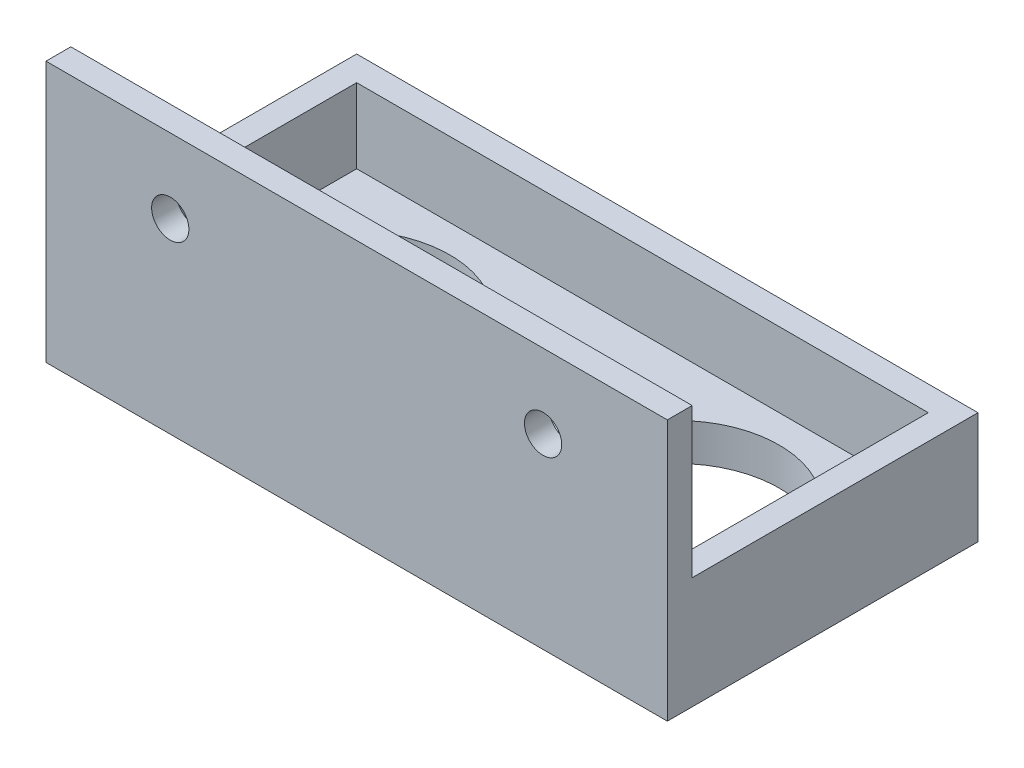
ISO-10303-21;
HEADER;
FILE_DESCRIPTION(('STEP AP214'),'2;1');
FILE_NAME('part.step','',(''),(''),'','','');
FILE_SCHEMA(('AUTOMOTIVE_DESIGN { 1 0 10303 214 1 1 1 1 }'));
ENDSEC;
DATA;
#1=APPLICATION_CONTEXT('core data for automotive mechanical design processes');
#2=APPLICATION_PROTOCOL_DEFINITION('international standard','automotive_design',2000,#1);
#3=PRODUCT_CONTEXT('',#1,'mechanical');
#4=PRODUCT('Part','Part','',(#3));
#5=PRODUCT_RELATED_PRODUCT_CATEGORY('part','',(#4));
#6=PRODUCT_DEFINITION_FORMATION('','',#4);
#7=PRODUCT_DEFINITION_CONTEXT('part definition',#1,'design');
#8=PRODUCT_DEFINITION('design','',#6,#7);
#9=PRODUCT_DEFINITION_SHAPE('','',#8);
#10=(LENGTH_UNIT() NAMED_UNIT(*) SI_UNIT(.MILLI.,.METRE.));
#11=(NAMED_UNIT(*) PLANE_ANGLE_UNIT() SI_UNIT($,.RADIAN.));
#12=(NAMED_UNIT(*) SI_UNIT($,.STERADIAN.) SOLID_ANGLE_UNIT());
#13=UNCERTAINTY_MEASURE_WITH_UNIT(LENGTH_MEASURE(1.E-05),#10,'distance_accuracy_value','');
#14=(GEOMETRIC_REPRESENTATION_CONTEXT(3) GLOBAL_UNCERTAINTY_ASSIGNED_CONTEXT((#13)) GLOBAL_UNIT_ASSIGNED_CONTEXT((#10,
#11,#12)) REPRESENTATION_CONTEXT('',''));
#15=CARTESIAN_POINT('',(0.,0.,0.));
#16=DIRECTION('',(0.,0.,1.));
#17=DIRECTION('',(1.,0.,0.));
#18=AXIS2_PLACEMENT_3D('',#15,#16,#17);
#19=CARTESIAN_POINT('',(-25.,3.,-12.5));
#20=DIRECTION('',(1.,0.,0.));
#21=DIRECTION('',(0.,0.,-1.));
#22=AXIS2_PLACEMENT_3D('',#19,#20,#21);
#23=PLANE('',#22);
#24=DIRECTION('',(0.,0.,1.));
#25=VECTOR('',#24,1.);
#26=CARTESIAN_POINT('',(-25.,0.,-12.5));
#27=LINE('',#26,#25);
#28=CARTESIAN_POINT('',(-25.,0.,-12.5));
#29=VERTEX_POINT('',#28);
#30=CARTESIAN_POINT('',(-25.,0.,12.5));
#31=VERTEX_POINT('',#30);
#32=EDGE_CURVE('E116',#29,#31,#27,.T.);
#33=ORIENTED_EDGE('',*,*,#32,.T.);
#34=DIRECTION('',(0.,-1.,0.));
#35=VECTOR('',#34,1.);
#36=CARTESIAN_POINT('',(-25.,3.,12.5));
#37=LINE('',#36,#35);
#38=CARTESIAN_POINT('',(-25.,21.,12.5));
#39=VERTEX_POINT('',#38);
#40=EDGE_CURVE('E35',#39,#31,#37,.T.);
#41=ORIENTED_EDGE('',*,*,#40,.F.);
#42=DIRECTION('',(0.,0.,1.));
#43=VECTOR('',#42,1.);
#44=CARTESIAN_POINT('',(-25.,21.,10.5));
#45=LINE('',#44,#43);
#46=CARTESIAN_POINT('',(-25.,21.,10.5));
#47=VERTEX_POINT('',#46);
#48=EDGE_CURVE('E114',#47,#39,#45,.T.);
#49=ORIENTED_EDGE('',*,*,#48,.F.);
#50=DIRECTION('',(0.,-1.,0.));
#51=VECTOR('',#50,1.);
#52=CARTESIAN_POINT('',(-25.,21.,10.5));
#53=LINE('',#52,#51);
#54=CARTESIAN_POINT('',(-25.,9.,10.5));
#55=VERTEX_POINT('',#54);
#56=EDGE_CURVE('E138',#47,#55,#53,.T.);
#57=ORIENTED_EDGE('',*,*,#56,.T.);
#58=DIRECTION('',(0.,0.,1.));
#59=VECTOR('',#58,1.);
#60=CARTESIAN_POINT('',(-25.,9.,0.));
#61=LINE('',#60,#59);
#62=CARTESIAN_POINT('',(-25.,9.,-12.5));
#63=VERTEX_POINT('',#62);
#64=EDGE_CURVE('E158',#63,#55,#61,.T.);
#65=ORIENTED_EDGE('',*,*,#64,.F.);
#66=DIRECTION('',(0.,-1.,0.));
#67=VECTOR('',#66,1.);
#68=CARTESIAN_POINT('',(-25.,3.,-12.5));
#69=LINE('',#68,#67);
#70=EDGE_CURVE('E199',#63,#29,#69,.T.);
#71=ORIENTED_EDGE('',*,*,#70,.T.);
#72=EDGE_LOOP('',(#33,#41,#49,#57,#65,#71));
#73=FACE_BOUND('',#72,.T.);
#74=ADVANCED_FACE('F32',(#73),#23,.F.);
#75=CARTESIAN_POINT('',(-25.,3.,12.5));
#76=DIRECTION('',(0.,0.,-1.));
#77=DIRECTION('',(-1.,0.,0.));
#78=AXIS2_PLACEMENT_3D('',#75,#76,#77);
#79=PLANE('',#78);
#80=CARTESIAN_POINT('',(15.,15.0267379497073,12.5));
#81=DIRECTION('',(0.,0.,-1.));
#82=DIRECTION('',(-1.,0.,0.));
#83=AXIS2_PLACEMENT_3D('',#80,#81,#82);
#84=CIRCLE('',#83,1.5);
#85=CARTESIAN_POINT('',(13.5,15.0267379497073,12.5));
#86=VERTEX_POINT('',#85);
#87=EDGE_CURVE('E132',#86,#86,#84,.T.);
#88=ORIENTED_EDGE('',*,*,#87,.T.);
#89=EDGE_LOOP('',(#88));
#90=FACE_BOUND('',#89,.T.);
#91=CARTESIAN_POINT('',(-15.,15.0267379497073,12.5));
#92=DIRECTION('',(0.,0.,-1.));
#93=DIRECTION('',(-1.,0.,0.));
#94=AXIS2_PLACEMENT_3D('',#91,#92,#93);
#95=CIRCLE('',#94,1.5);
#96=CARTESIAN_POINT('',(-16.5,15.0267379497073,12.5));
#97=VERTEX_POINT('',#96);
#98=EDGE_CURVE('E277',#97,#97,#95,.T.);
#99=ORIENTED_EDGE('',*,*,#98,.T.);
#100=EDGE_LOOP('',(#99));
#101=FACE_BOUND('',#100,.T.);
#102=DIRECTION('',(1.,0.,0.));
#103=VECTOR('',#102,1.);
#104=CARTESIAN_POINT('',(-25.,0.,12.5));
#105=LINE('',#104,#103);
#106=CARTESIAN_POINT('',(25.,0.,12.5));
#107=VERTEX_POINT('',#106);
#108=EDGE_CURVE('E191',#31,#107,#105,.T.);
#109=ORIENTED_EDGE('',*,*,#108,.T.);
#110=DIRECTION('',(0.,-1.,0.));
#111=VECTOR('',#110,1.);
#112=CARTESIAN_POINT('',(25.,3.,12.5));
#113=LINE('',#112,#111);
#114=CARTESIAN_POINT('',(25.,21.,12.5));
#115=VERTEX_POINT('',#114);
#116=EDGE_CURVE('E119',#115,#107,#113,.T.);
#117=ORIENTED_EDGE('',*,*,#116,.F.);
#118=DIRECTION('',(1.,0.,0.));
#119=VECTOR('',#118,1.);
#120=CARTESIAN_POINT('',(-25.,21.,12.5));
#121=LINE('',#120,#119);
#122=EDGE_CURVE('E121',#39,#115,#121,.T.);
#123=ORIENTED_EDGE('',*,*,#122,.F.);
#124=ORIENTED_EDGE('',*,*,#40,.T.);
#125=EDGE_LOOP('',(#109,#117,#123,#124));
#126=FACE_BOUND('',#125,.T.);
#127=ADVANCED_FACE('F122',(#90,#101,#126),#79,.F.);
#128=CARTESIAN_POINT('',(25.,3.,-12.5));
#129=DIRECTION('',(1.,0.,0.));
#130=DIRECTION('',(0.,0.,-1.));
#131=AXIS2_PLACEMENT_3D('',#128,#129,#130);
#132=PLANE('',#131);
#133=DIRECTION('',(0.,0.,1.));
#134=VECTOR('',#133,1.);
#135=CARTESIAN_POINT('',(25.,0.,-12.5));
#136=LINE('',#135,#134);
#137=CARTESIAN_POINT('',(25.,0.,-12.5));
#138=VERTEX_POINT('',#137);
#139=EDGE_CURVE('E193',#138,#107,#136,.T.);
#140=ORIENTED_EDGE('',*,*,#139,.F.);
#141=DIRECTION('',(0.,-1.,0.));
#142=VECTOR('',#141,1.);
#143=CARTESIAN_POINT('',(25.,3.,-12.5));
#144=LINE('',#143,#142);
#145=CARTESIAN_POINT('',(25.,9.,-12.5));
#146=VERTEX_POINT('',#145);
#147=EDGE_CURVE('E201',#146,#138,#144,.T.);
#148=ORIENTED_EDGE('',*,*,#147,.F.);
#149=DIRECTION('',(0.,0.,-1.));
#150=VECTOR('',#149,1.);
#151=CARTESIAN_POINT('',(25.,9.,0.));
#152=LINE('',#151,#150);
#153=CARTESIAN_POINT('',(25.,9.,10.5));
#154=VERTEX_POINT('',#153);
#155=EDGE_CURVE('E160',#154,#146,#152,.T.);
#156=ORIENTED_EDGE('',*,*,#155,.F.);
#157=DIRECTION('',(0.,-1.,0.));
#158=VECTOR('',#157,1.);
#159=CARTESIAN_POINT('',(25.,21.,10.5));
#160=LINE('',#159,#158);
#161=CARTESIAN_POINT('',(25.,21.,10.5));
#162=VERTEX_POINT('',#161);
#163=EDGE_CURVE('E141',#162,#154,#160,.T.);
#164=ORIENTED_EDGE('',*,*,#163,.F.);
#165=DIRECTION('',(0.,0.,-1.));
#166=VECTOR('',#165,1.);
#167=CARTESIAN_POINT('',(25.,21.,10.5));
#168=LINE('',#167,#166);
#169=EDGE_CURVE('E125',#115,#162,#168,.T.);
#170=ORIENTED_EDGE('',*,*,#169,.F.);
#171=ORIENTED_EDGE('',*,*,#116,.T.);
#172=EDGE_LOOP('',(#140,#148,#156,#164,#170,#171));
#173=FACE_BOUND('',#172,.T.);
#174=ADVANCED_FACE('F204',(#173),#132,.T.);
#175=CARTESIAN_POINT('',(-25.,3.,-12.5));
#176=DIRECTION('',(0.,0.,-1.));
#177=DIRECTION('',(-1.,0.,0.));
#178=AXIS2_PLACEMENT_3D('',#175,#176,#177);
#179=PLANE('',#178);
#180=DIRECTION('',(1.,0.,0.));
#181=VECTOR('',#180,1.);
#182=CARTESIAN_POINT('',(-25.,0.,-12.5));
#183=LINE('',#182,#181);
#184=EDGE_CURVE('E196',#29,#138,#183,.T.);
#185=ORIENTED_EDGE('',*,*,#184,.F.);
#186=ORIENTED_EDGE('',*,*,#70,.F.);
#187=DIRECTION('',(-1.,0.,0.));
#188=VECTOR('',#187,1.);
#189=CARTESIAN_POINT('',(0.,9.,-12.5));
#190=LINE('',#189,#188);
#191=EDGE_CURVE('E155',#146,#63,#190,.T.);
#192=ORIENTED_EDGE('',*,*,#191,.F.);
#193=ORIENTED_EDGE('',*,*,#147,.T.);
#194=EDGE_LOOP('',(#185,#186,#192,#193));
#195=FACE_BOUND('',#194,.T.);
#196=ADVANCED_FACE('F211',(#195),#179,.T.);
#197=CARTESIAN_POINT('',(0.,3.,0.));
#198=DIRECTION('',(0.,1.,0.));
#199=DIRECTION('',(0.,0.,1.));
#200=AXIS2_PLACEMENT_3D('',#197,#198,#199);
#201=PLANE('',#200);
#202=DIRECTION('',(-1.,0.,0.));
#203=VECTOR('',#202,1.);
#204=CARTESIAN_POINT('',(0.,3.,-10.5));
#205=LINE('',#204,#203);
#206=CARTESIAN_POINT('',(23.,3.,-10.5));
#207=VERTEX_POINT('',#206);
#208=CARTESIAN_POINT('',(-23.,3.,-10.5));
#209=VERTEX_POINT('',#208);
#210=EDGE_CURVE('E144',#207,#209,#205,.T.);
#211=ORIENTED_EDGE('',*,*,#210,.T.);
#212=DIRECTION('',(0.,0.,1.));
#213=VECTOR('',#212,1.);
#214=CARTESIAN_POINT('',(-23.,3.,0.));
#215=LINE('',#214,#213);
#216=CARTESIAN_POINT('',(-23.,3.,10.5));
#217=VERTEX_POINT('',#216);
#218=EDGE_CURVE('E149',#209,#217,#215,.T.);
#219=ORIENTED_EDGE('',*,*,#218,.T.);
#220=DIRECTION('',(1.,0.,0.));
#221=VECTOR('',#220,1.);
#222=CARTESIAN_POINT('',(0.,3.,10.5));
#223=LINE('',#222,#221);
#224=CARTESIAN_POINT('',(23.,3.,10.5));
#225=VERTEX_POINT('',#224);
#226=EDGE_CURVE('E165',#217,#225,#223,.T.);
#227=ORIENTED_EDGE('',*,*,#226,.T.);
#228=DIRECTION('',(0.,0.,-1.));
#229=VECTOR('',#228,1.);
#230=CARTESIAN_POINT('',(23.,3.,0.));
#231=LINE('',#230,#229);
#232=EDGE_CURVE('E55',#225,#207,#231,.T.);
#233=ORIENTED_EDGE('',*,*,#232,.T.);
#234=EDGE_LOOP('',(#211,#219,#227,#233));
#235=FACE_BOUND('',#234,.T.);
#236=CARTESIAN_POINT('',(13.25,3.,0.));
#237=DIRECTION('',(0.,1.,0.));
#238=DIRECTION('',(0.,0.,1.));
#239=AXIS2_PLACEMENT_3D('',#236,#237,#238);
#240=CIRCLE('',#239,8.25);
#241=CARTESIAN_POINT('',(13.25,3.,8.25));
#242=VERTEX_POINT('',#241);
#243=EDGE_CURVE('E182',#242,#242,#240,.T.);
#244=ORIENTED_EDGE('',*,*,#243,.F.);
#245=EDGE_LOOP('',(#244));
#246=FACE_BOUND('',#245,.T.);
#247=CARTESIAN_POINT('',(-13.25,3.,0.));
#248=DIRECTION('',(0.,1.,0.));
#249=DIRECTION('',(0.,0.,1.));
#250=AXIS2_PLACEMENT_3D('',#247,#248,#249);
#251=CIRCLE('',#250,8.25);
#252=CARTESIAN_POINT('',(-13.25,3.,8.25));
#253=VERTEX_POINT('',#252);
#254=EDGE_CURVE('E178',#253,#253,#251,.T.);
#255=ORIENTED_EDGE('',*,*,#254,.F.);
#256=EDGE_LOOP('',(#255));
#257=FACE_BOUND('',#256,.T.);
#258=ADVANCED_FACE('F244',(#235,#246,#257),#201,.T.);
#259=CARTESIAN_POINT('',(0.,0.,0.));
#260=DIRECTION('',(0.,1.,0.));
#261=DIRECTION('',(0.,0.,1.));
#262=AXIS2_PLACEMENT_3D('',#259,#260,#261);
#263=PLANE('',#262);
#264=CARTESIAN_POINT('',(13.25,0.,0.));
#265=DIRECTION('',(0.,1.,0.));
#266=DIRECTION('',(0.,0.,1.));
#267=AXIS2_PLACEMENT_3D('',#264,#265,#266);
#268=CIRCLE('',#267,8.25);
#269=CARTESIAN_POINT('',(13.25,0.,8.25));
#270=VERTEX_POINT('',#269);
#271=EDGE_CURVE('E179',#270,#270,#268,.T.);
#272=ORIENTED_EDGE('',*,*,#271,.T.);
#273=EDGE_LOOP('',(#272));
#274=FACE_BOUND('',#273,.T.);
#275=CARTESIAN_POINT('',(-13.25,0.,0.));
#276=DIRECTION('',(0.,1.,0.));
#277=DIRECTION('',(0.,0.,1.));
#278=AXIS2_PLACEMENT_3D('',#275,#276,#277);
#279=CIRCLE('',#278,8.25);
#280=CARTESIAN_POINT('',(-13.25,0.,8.25));
#281=VERTEX_POINT('',#280);
#282=EDGE_CURVE('E185',#281,#281,#279,.T.);
#283=ORIENTED_EDGE('',*,*,#282,.T.);
#284=EDGE_LOOP('',(#283));
#285=FACE_BOUND('',#284,.T.);
#286=ORIENTED_EDGE('',*,*,#32,.F.);
#287=ORIENTED_EDGE('',*,*,#184,.T.);
#288=ORIENTED_EDGE('',*,*,#139,.T.);
#289=ORIENTED_EDGE('',*,*,#108,.F.);
#290=EDGE_LOOP('',(#286,#287,#288,#289));
#291=FACE_BOUND('',#290,.T.);
#292=ADVANCED_FACE('F208',(#274,#285,#291),#263,.F.);
#293=CARTESIAN_POINT('',(-13.25,0.,0.));
#294=DIRECTION('',(0.,1.,0.));
#295=DIRECTION('',(0.,0.,1.));
#296=AXIS2_PLACEMENT_3D('',#293,#294,#295);
#297=CYLINDRICAL_SURFACE('',#296,8.25);
#298=ORIENTED_EDGE('',*,*,#282,.F.);
#299=EDGE_LOOP('',(#298));
#300=FACE_BOUND('',#299,.T.);
#301=ORIENTED_EDGE('',*,*,#254,.T.);
#302=EDGE_LOOP('',(#301));
#303=FACE_BOUND('',#302,.T.);
#304=ADVANCED_FACE('F247',(#300,#303),#297,.F.);
#305=CARTESIAN_POINT('',(13.25,0.,0.));
#306=DIRECTION('',(0.,1.,0.));
#307=DIRECTION('',(0.,0.,1.));
#308=AXIS2_PLACEMENT_3D('',#305,#306,#307);
#309=CYLINDRICAL_SURFACE('',#308,8.25);
#310=ORIENTED_EDGE('',*,*,#271,.F.);
#311=EDGE_LOOP('',(#310));
#312=FACE_BOUND('',#311,.T.);
#313=ORIENTED_EDGE('',*,*,#243,.T.);
#314=EDGE_LOOP('',(#313));
#315=FACE_BOUND('',#314,.T.);
#316=ADVANCED_FACE('F253',(#312,#315),#309,.F.);
#317=CARTESIAN_POINT('',(0.,9.,-10.5));
#318=DIRECTION('',(0.,0.,1.));
#319=DIRECTION('',(1.,0.,0.));
#320=AXIS2_PLACEMENT_3D('',#317,#318,#319);
#321=PLANE('',#320);
#322=ORIENTED_EDGE('',*,*,#210,.F.);
#323=DIRECTION('',(0.,-1.,0.));
#324=VECTOR('',#323,1.);
#325=CARTESIAN_POINT('',(23.,9.,-10.5));
#326=LINE('',#325,#324);
#327=CARTESIAN_POINT('',(23.,9.,-10.5));
#328=VERTEX_POINT('',#327);
#329=EDGE_CURVE('E176',#328,#207,#326,.T.);
#330=ORIENTED_EDGE('',*,*,#329,.F.);
#331=DIRECTION('',(-1.,0.,0.));
#332=VECTOR('',#331,1.);
#333=CARTESIAN_POINT('',(0.,9.,-10.5));
#334=LINE('',#333,#332);
#335=CARTESIAN_POINT('',(-23.,9.,-10.5));
#336=VERTEX_POINT('',#335);
#337=EDGE_CURVE('E145',#328,#336,#334,.T.);
#338=ORIENTED_EDGE('',*,*,#337,.T.);
#339=DIRECTION('',(0.,-1.,0.));
#340=VECTOR('',#339,1.);
#341=CARTESIAN_POINT('',(-23.,9.,-10.5));
#342=LINE('',#341,#340);
#343=EDGE_CURVE('E162',#336,#209,#342,.T.);
#344=ORIENTED_EDGE('',*,*,#343,.T.);
#345=EDGE_LOOP('',(#322,#330,#338,#344));
#346=FACE_BOUND('',#345,.T.);
#347=ADVANCED_FACE('F257',(#346),#321,.T.);
#348=CARTESIAN_POINT('',(23.,9.,0.));
#349=DIRECTION('',(-1.,0.,0.));
#350=DIRECTION('',(0.,0.,1.));
#351=AXIS2_PLACEMENT_3D('',#348,#349,#350);
#352=PLANE('',#351);
#353=ORIENTED_EDGE('',*,*,#232,.F.);
#354=DIRECTION('',(0.,-1.,0.));
#355=VECTOR('',#354,1.);
#356=CARTESIAN_POINT('',(23.,9.,10.5));
#357=LINE('',#356,#355);
#358=CARTESIAN_POINT('',(23.,9.,10.5));
#359=VERTEX_POINT('',#358);
#360=EDGE_CURVE('E173',#359,#225,#357,.T.);
#361=ORIENTED_EDGE('',*,*,#360,.F.);
#362=DIRECTION('',(0.,0.,-1.));
#363=VECTOR('',#362,1.);
#364=CARTESIAN_POINT('',(23.,9.,0.));
#365=LINE('',#364,#363);
#366=EDGE_CURVE('E148',#359,#328,#365,.T.);
#367=ORIENTED_EDGE('',*,*,#366,.T.);
#368=ORIENTED_EDGE('',*,*,#329,.T.);
#369=EDGE_LOOP('',(#353,#361,#367,#368));
#370=FACE_BOUND('',#369,.T.);
#371=ADVANCED_FACE('F261',(#370),#352,.T.);
#372=CARTESIAN_POINT('',(0.,9.,10.5));
#373=DIRECTION('',(0.,0.,-1.));
#374=DIRECTION('',(-1.,0.,0.));
#375=AXIS2_PLACEMENT_3D('',#372,#373,#374);
#376=PLANE('',#375);
#377=CARTESIAN_POINT('',(15.,15.0267379497073,10.5));
#378=DIRECTION('',(0.,0.,-1.));
#379=DIRECTION('',(-1.,0.,0.));
#380=AXIS2_PLACEMENT_3D('',#377,#378,#379);
#381=CIRCLE('',#380,1.5);
#382=CARTESIAN_POINT('',(13.5,15.0267379497073,10.5));
#383=VERTEX_POINT('',#382);
#384=EDGE_CURVE('E273',#383,#383,#381,.T.);
#385=ORIENTED_EDGE('',*,*,#384,.F.);
#386=EDGE_LOOP('',(#385));
#387=FACE_BOUND('',#386,.T.);
#388=CARTESIAN_POINT('',(-15.,15.0267379497073,10.5));
#389=DIRECTION('',(0.,0.,-1.));
#390=DIRECTION('',(-1.,0.,0.));
#391=AXIS2_PLACEMENT_3D('',#388,#389,#390);
#392=CIRCLE('',#391,1.5);
#393=CARTESIAN_POINT('',(-16.5,15.0267379497073,10.5));
#394=VERTEX_POINT('',#393);
#395=EDGE_CURVE('E134',#394,#394,#392,.T.);
#396=ORIENTED_EDGE('',*,*,#395,.F.);
#397=EDGE_LOOP('',(#396));
#398=FACE_BOUND('',#397,.T.);
#399=ORIENTED_EDGE('',*,*,#226,.F.);
#400=DIRECTION('',(0.,-1.,0.));
#401=VECTOR('',#400,1.);
#402=CARTESIAN_POINT('',(-23.,9.,10.5));
#403=LINE('',#402,#401);
#404=CARTESIAN_POINT('',(-23.,9.,10.5));
#405=VERTEX_POINT('',#404);
#406=EDGE_CURVE('E170',#405,#217,#403,.T.);
#407=ORIENTED_EDGE('',*,*,#406,.F.);
#408=DIRECTION('',(-1.,0.,0.));
#409=VECTOR('',#408,1.);
#410=CARTESIAN_POINT('',(25.,9.,10.5));
#411=LINE('',#410,#409);
#412=EDGE_CURVE('E11',#405,#55,#411,.T.);
#413=ORIENTED_EDGE('',*,*,#412,.T.);
#414=ORIENTED_EDGE('',*,*,#56,.F.);
#415=DIRECTION('',(-1.,0.,0.));
#416=VECTOR('',#415,1.);
#417=CARTESIAN_POINT('',(25.,21.,10.5));
#418=LINE('',#417,#416);
#419=EDGE_CURVE('E129',#162,#47,#418,.T.);
#420=ORIENTED_EDGE('',*,*,#419,.F.);
#421=ORIENTED_EDGE('',*,*,#163,.T.);
#422=EDGE_CURVE('E41',#154,#359,#411,.T.);
#423=ORIENTED_EDGE('',*,*,#422,.T.);
#424=ORIENTED_EDGE('',*,*,#360,.T.);
#425=EDGE_LOOP('',(#399,#407,#413,#414,#420,#421,#423,#424));
#426=FACE_BOUND('',#425,.T.);
#427=ADVANCED_FACE('F216',(#387,#398,#426),#376,.T.);
#428=CARTESIAN_POINT('',(-23.,9.,0.));
#429=DIRECTION('',(1.,0.,0.));
#430=DIRECTION('',(0.,0.,-1.));
#431=AXIS2_PLACEMENT_3D('',#428,#429,#430);
#432=PLANE('',#431);
#433=ORIENTED_EDGE('',*,*,#218,.F.);
#434=ORIENTED_EDGE('',*,*,#343,.F.);
#435=DIRECTION('',(0.,0.,1.));
#436=VECTOR('',#435,1.);
#437=CARTESIAN_POINT('',(-23.,9.,0.));
#438=LINE('',#437,#436);
#439=EDGE_CURVE('E152',#336,#405,#438,.T.);
#440=ORIENTED_EDGE('',*,*,#439,.T.);
#441=ORIENTED_EDGE('',*,*,#406,.T.);
#442=EDGE_LOOP('',(#433,#434,#440,#441));
#443=FACE_BOUND('',#442,.T.);
#444=ADVANCED_FACE('F220',(#443),#432,.T.);
#445=CARTESIAN_POINT('',(0.,9.,0.));
#446=DIRECTION('',(0.,1.,0.));
#447=DIRECTION('',(0.,0.,1.));
#448=AXIS2_PLACEMENT_3D('',#445,#446,#447);
#449=PLANE('',#448);
#450=ORIENTED_EDGE('',*,*,#422,.F.);
#451=ORIENTED_EDGE('',*,*,#155,.T.);
#452=ORIENTED_EDGE('',*,*,#191,.T.);
#453=ORIENTED_EDGE('',*,*,#64,.T.);
#454=ORIENTED_EDGE('',*,*,#412,.F.);
#455=ORIENTED_EDGE('',*,*,#439,.F.);
#456=ORIENTED_EDGE('',*,*,#337,.F.);
#457=ORIENTED_EDGE('',*,*,#366,.F.);
#458=EDGE_LOOP('',(#450,#451,#452,#453,#454,#455,#456,#457));
#459=FACE_BOUND('',#458,.T.);
#460=ADVANCED_FACE('F218',(#459),#449,.T.);
#461=CARTESIAN_POINT('',(0.,21.,0.));
#462=DIRECTION('',(0.,1.,0.));
#463=DIRECTION('',(0.,0.,1.));
#464=AXIS2_PLACEMENT_3D('',#461,#462,#463);
#465=PLANE('',#464);
#466=ORIENTED_EDGE('',*,*,#48,.T.);
#467=ORIENTED_EDGE('',*,*,#122,.T.);
#468=ORIENTED_EDGE('',*,*,#169,.T.);
#469=ORIENTED_EDGE('',*,*,#419,.T.);
#470=EDGE_LOOP('',(#466,#467,#468,#469));
#471=FACE_BOUND('',#470,.T.);
#472=ADVANCED_FACE('F127',(#471),#465,.T.);
#473=CARTESIAN_POINT('',(-15.,15.0267379497073,12.5));
#474=DIRECTION('',(0.,0.,-1.));
#475=DIRECTION('',(-1.,0.,0.));
#476=AXIS2_PLACEMENT_3D('',#473,#474,#475);
#477=CYLINDRICAL_SURFACE('',#476,1.5);
#478=ORIENTED_EDGE('',*,*,#98,.F.);
#479=EDGE_LOOP('',(#478));
#480=FACE_BOUND('',#479,.T.);
#481=ORIENTED_EDGE('',*,*,#395,.T.);
#482=EDGE_LOOP('',(#481));
#483=FACE_BOUND('',#482,.T.);
#484=ADVANCED_FACE('F226',(#480,#483),#477,.F.);
#485=CARTESIAN_POINT('',(15.,15.0267379497073,12.5));
#486=DIRECTION('',(0.,0.,-1.));
#487=DIRECTION('',(-1.,0.,0.));
#488=AXIS2_PLACEMENT_3D('',#485,#486,#487);
#489=CYLINDRICAL_SURFACE('',#488,1.5);
#490=ORIENTED_EDGE('',*,*,#87,.F.);
#491=EDGE_LOOP('',(#490));
#492=FACE_BOUND('',#491,.T.);
#493=ORIENTED_EDGE('',*,*,#384,.T.);
#494=EDGE_LOOP('',(#493));
#495=FACE_BOUND('',#494,.T.);
#496=ADVANCED_FACE('F284',(#492,#495),#489,.F.);
#497=CLOSED_SHELL('',(#74,#127,#174,#196,#258,#292,#304,#316,#347,#371,#427,#444,#460,#472,#484,#496));
#498=MANIFOLD_SOLID_BREP('B2',#497);
#499=ADVANCED_BREP_SHAPE_REPRESENTATION('',(#18,#498),#14);
#500=SHAPE_DEFINITION_REPRESENTATION(#9,#499);
ENDSEC;
END-ISO-10303-21;
